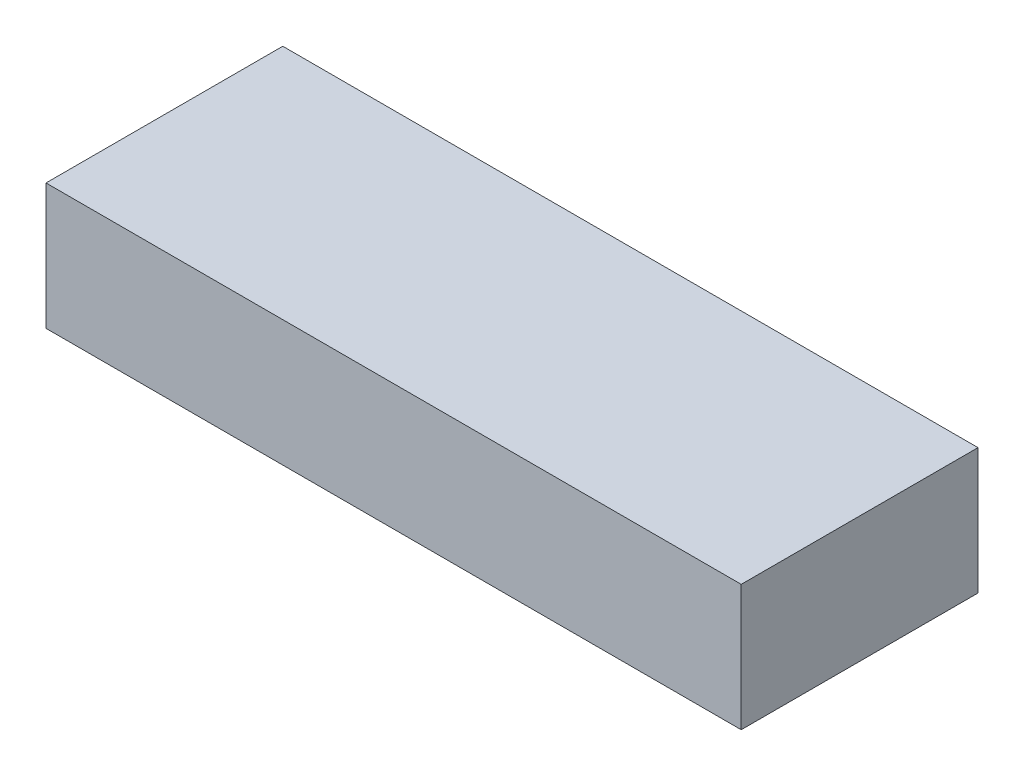
ISO-10303-21;
HEADER;
FILE_DESCRIPTION(('STEP AP214'),'2;1');
FILE_NAME('part.step','',(''),(''),'','','');
FILE_SCHEMA(('AUTOMOTIVE_DESIGN { 1 0 10303 214 1 1 1 1 }'));
ENDSEC;
DATA;
#1=APPLICATION_CONTEXT('core data for automotive mechanical design processes');
#2=APPLICATION_PROTOCOL_DEFINITION('international standard','automotive_design',2000,#1);
#3=PRODUCT_CONTEXT('',#1,'mechanical');
#4=PRODUCT('Part','Part','',(#3));
#5=PRODUCT_RELATED_PRODUCT_CATEGORY('part','',(#4));
#6=PRODUCT_DEFINITION_FORMATION('','',#4);
#7=PRODUCT_DEFINITION_CONTEXT('part definition',#1,'design');
#8=PRODUCT_DEFINITION('design','',#6,#7);
#9=PRODUCT_DEFINITION_SHAPE('','',#8);
#10=(LENGTH_UNIT() NAMED_UNIT(*) SI_UNIT(.MILLI.,.METRE.));
#11=(NAMED_UNIT(*) PLANE_ANGLE_UNIT() SI_UNIT($,.RADIAN.));
#12=(NAMED_UNIT(*) SI_UNIT($,.STERADIAN.) SOLID_ANGLE_UNIT());
#13=UNCERTAINTY_MEASURE_WITH_UNIT(LENGTH_MEASURE(1.E-05),#10,'distance_accuracy_value','');
#14=(GEOMETRIC_REPRESENTATION_CONTEXT(3) GLOBAL_UNCERTAINTY_ASSIGNED_CONTEXT((#13)) GLOBAL_UNIT_ASSIGNED_CONTEXT((#10,
#11,#12)) REPRESENTATION_CONTEXT('',''));
#15=CARTESIAN_POINT('',(0.,0.,0.));
#16=DIRECTION('',(0.,0.,1.));
#17=DIRECTION('',(1.,0.,0.));
#18=AXIS2_PLACEMENT_3D('',#15,#16,#17);
#19=CARTESIAN_POINT('',(0.,25.,0.));
#20=DIRECTION('',(1.,0.,0.));
#21=DIRECTION('',(0.,0.,-1.));
#22=AXIS2_PLACEMENT_3D('',#19,#20,#21);
#23=PLANE('',#22);
#24=DIRECTION('',(0.,0.,1.));
#25=VECTOR('',#24,1.);
#26=CARTESIAN_POINT('',(0.,0.,0.));
#27=LINE('',#26,#25);
#28=CARTESIAN_POINT('',(0.,0.,-47.));
#29=VERTEX_POINT('',#28);
#30=CARTESIAN_POINT('',(0.,0.,0.));
#31=VERTEX_POINT('',#30);
#32=EDGE_CURVE('E102',#29,#31,#27,.T.);
#33=ORIENTED_EDGE('',*,*,#32,.T.);
#34=DIRECTION('',(0.,-1.,0.));
#35=VECTOR('',#34,1.);
#36=CARTESIAN_POINT('',(0.,25.,0.));
#37=LINE('',#36,#35);
#38=CARTESIAN_POINT('',(0.,25.,0.));
#39=VERTEX_POINT('',#38);
#40=EDGE_CURVE('E11',#39,#31,#37,.T.);
#41=ORIENTED_EDGE('',*,*,#40,.F.);
#42=DIRECTION('',(0.,0.,1.));
#43=VECTOR('',#42,1.);
#44=CARTESIAN_POINT('',(0.,25.,0.));
#45=LINE('',#44,#43);
#46=CARTESIAN_POINT('',(0.,25.,-47.));
#47=VERTEX_POINT('',#46);
#48=EDGE_CURVE('E90',#47,#39,#45,.T.);
#49=ORIENTED_EDGE('',*,*,#48,.F.);
#50=DIRECTION('',(0.,-1.,0.));
#51=VECTOR('',#50,1.);
#52=CARTESIAN_POINT('',(0.,25.,-47.));
#53=LINE('',#52,#51);
#54=EDGE_CURVE('E98',#47,#29,#53,.T.);
#55=ORIENTED_EDGE('',*,*,#54,.T.);
#56=EDGE_LOOP('',(#33,#41,#49,#55));
#57=FACE_BOUND('',#56,.T.);
#58=ADVANCED_FACE('F39',(#57),#23,.F.);
#59=CARTESIAN_POINT('',(0.,25.,0.));
#60=DIRECTION('',(0.,0.,-1.));
#61=DIRECTION('',(-1.,0.,0.));
#62=AXIS2_PLACEMENT_3D('',#59,#60,#61);
#63=PLANE('',#62);
#64=DIRECTION('',(1.,0.,0.));
#65=VECTOR('',#64,1.);
#66=CARTESIAN_POINT('',(0.,0.,0.));
#67=LINE('',#66,#65);
#68=CARTESIAN_POINT('',(138.,0.,0.));
#69=VERTEX_POINT('',#68);
#70=EDGE_CURVE('E94',#31,#69,#67,.T.);
#71=ORIENTED_EDGE('',*,*,#70,.T.);
#72=DIRECTION('',(0.,-1.,0.));
#73=VECTOR('',#72,1.);
#74=CARTESIAN_POINT('',(138.,25.,0.));
#75=LINE('',#74,#73);
#76=CARTESIAN_POINT('',(138.,25.,0.));
#77=VERTEX_POINT('',#76);
#78=EDGE_CURVE('E47',#77,#69,#75,.T.);
#79=ORIENTED_EDGE('',*,*,#78,.F.);
#80=DIRECTION('',(1.,0.,0.));
#81=VECTOR('',#80,1.);
#82=CARTESIAN_POINT('',(0.,25.,0.));
#83=LINE('',#82,#81);
#84=EDGE_CURVE('E85',#39,#77,#83,.T.);
#85=ORIENTED_EDGE('',*,*,#84,.F.);
#86=ORIENTED_EDGE('',*,*,#40,.T.);
#87=EDGE_LOOP('',(#71,#79,#85,#86));
#88=FACE_BOUND('',#87,.T.);
#89=ADVANCED_FACE('F93',(#88),#63,.F.);
#90=CARTESIAN_POINT('',(138.,25.,0.));
#91=DIRECTION('',(-1.,0.,0.));
#92=DIRECTION('',(0.,0.,1.));
#93=AXIS2_PLACEMENT_3D('',#90,#91,#92);
#94=PLANE('',#93);
#95=DIRECTION('',(0.,0.,-1.));
#96=VECTOR('',#95,1.);
#97=CARTESIAN_POINT('',(138.,0.,0.));
#98=LINE('',#97,#96);
#99=CARTESIAN_POINT('',(138.,0.,-47.));
#100=VERTEX_POINT('',#99);
#101=EDGE_CURVE('E72',#69,#100,#98,.T.);
#102=ORIENTED_EDGE('',*,*,#101,.T.);
#103=DIRECTION('',(0.,-1.,0.));
#104=VECTOR('',#103,1.);
#105=CARTESIAN_POINT('',(138.,25.,-47.));
#106=LINE('',#105,#104);
#107=CARTESIAN_POINT('',(138.,25.,-47.));
#108=VERTEX_POINT('',#107);
#109=EDGE_CURVE('E95',#108,#100,#106,.T.);
#110=ORIENTED_EDGE('',*,*,#109,.F.);
#111=DIRECTION('',(0.,0.,-1.));
#112=VECTOR('',#111,1.);
#113=CARTESIAN_POINT('',(138.,25.,0.));
#114=LINE('',#113,#112);
#115=EDGE_CURVE('E88',#77,#108,#114,.T.);
#116=ORIENTED_EDGE('',*,*,#115,.F.);
#117=ORIENTED_EDGE('',*,*,#78,.T.);
#118=EDGE_LOOP('',(#102,#110,#116,#117));
#119=FACE_BOUND('',#118,.T.);
#120=ADVANCED_FACE('F96',(#119),#94,.F.);
#121=CARTESIAN_POINT('',(0.,25.,-47.));
#122=DIRECTION('',(0.,0.,1.));
#123=DIRECTION('',(1.,0.,0.));
#124=AXIS2_PLACEMENT_3D('',#121,#122,#123);
#125=PLANE('',#124);
#126=DIRECTION('',(-1.,0.,0.));
#127=VECTOR('',#126,1.);
#128=CARTESIAN_POINT('',(0.,0.,-47.));
#129=LINE('',#128,#127);
#130=EDGE_CURVE('E78',#100,#29,#129,.T.);
#131=ORIENTED_EDGE('',*,*,#130,.T.);
#132=ORIENTED_EDGE('',*,*,#54,.F.);
#133=DIRECTION('',(-1.,0.,0.));
#134=VECTOR('',#133,1.);
#135=CARTESIAN_POINT('',(0.,25.,-47.));
#136=LINE('',#135,#134);
#137=EDGE_CURVE('E55',#108,#47,#136,.T.);
#138=ORIENTED_EDGE('',*,*,#137,.F.);
#139=ORIENTED_EDGE('',*,*,#109,.T.);
#140=EDGE_LOOP('',(#131,#132,#138,#139));
#141=FACE_BOUND('',#140,.T.);
#142=ADVANCED_FACE('F109',(#141),#125,.F.);
#143=CARTESIAN_POINT('',(0.,25.,0.));
#144=DIRECTION('',(0.,-1.,0.));
#145=DIRECTION('',(0.,0.,-1.));
#146=AXIS2_PLACEMENT_3D('',#143,#144,#145);
#147=PLANE('',#146);
#148=ORIENTED_EDGE('',*,*,#48,.T.);
#149=ORIENTED_EDGE('',*,*,#84,.T.);
#150=ORIENTED_EDGE('',*,*,#115,.T.);
#151=ORIENTED_EDGE('',*,*,#137,.T.);
#152=EDGE_LOOP('',(#148,#149,#150,#151));
#153=FACE_BOUND('',#152,.T.);
#154=ADVANCED_FACE('F86',(#153),#147,.F.);
#155=CARTESIAN_POINT('',(0.,0.,0.));
#156=DIRECTION('',(0.,-1.,0.));
#157=DIRECTION('',(0.,0.,-1.));
#158=AXIS2_PLACEMENT_3D('',#155,#156,#157);
#159=PLANE('',#158);
#160=ORIENTED_EDGE('',*,*,#32,.F.);
#161=ORIENTED_EDGE('',*,*,#130,.F.);
#162=ORIENTED_EDGE('',*,*,#101,.F.);
#163=ORIENTED_EDGE('',*,*,#70,.F.);
#164=EDGE_LOOP('',(#160,#161,#162,#163));
#165=FACE_BOUND('',#164,.T.);
#166=ADVANCED_FACE('F112',(#165),#159,.T.);
#167=CLOSED_SHELL('',(#58,#89,#120,#142,#154,#166));
#168=MANIFOLD_SOLID_BREP('B2',#167);
#169=ADVANCED_BREP_SHAPE_REPRESENTATION('',(#18,#168),#14);
#170=SHAPE_DEFINITION_REPRESENTATION(#9,#169);
ENDSEC;
END-ISO-10303-21;
